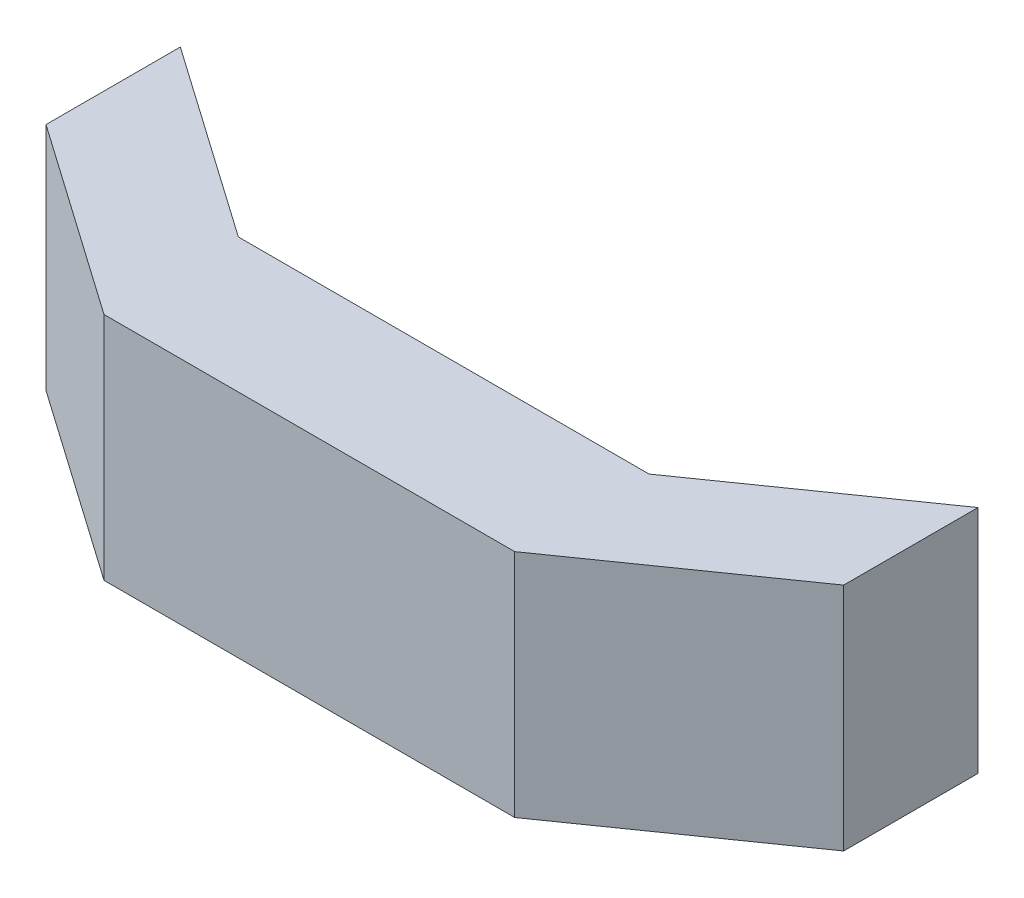
ISO-10303-21;
HEADER;
FILE_DESCRIPTION(('STEP AP214'),'2;1');
FILE_NAME('part.step','',(''),(''),'','','');
FILE_SCHEMA(('AUTOMOTIVE_DESIGN { 1 0 10303 214 1 1 1 1 }'));
ENDSEC;
DATA;
#1=APPLICATION_CONTEXT('core data for automotive mechanical design processes');
#2=APPLICATION_PROTOCOL_DEFINITION('international standard','automotive_design',2000,#1);
#3=PRODUCT_CONTEXT('',#1,'mechanical');
#4=PRODUCT('Part','Part','',(#3));
#5=PRODUCT_RELATED_PRODUCT_CATEGORY('part','',(#4));
#6=PRODUCT_DEFINITION_FORMATION('','',#4);
#7=PRODUCT_DEFINITION_CONTEXT('part definition',#1,'design');
#8=PRODUCT_DEFINITION('design','',#6,#7);
#9=PRODUCT_DEFINITION_SHAPE('','',#8);
#10=(LENGTH_UNIT() NAMED_UNIT(*) SI_UNIT(.MILLI.,.METRE.));
#11=(NAMED_UNIT(*) PLANE_ANGLE_UNIT() SI_UNIT($,.RADIAN.));
#12=(NAMED_UNIT(*) SI_UNIT($,.STERADIAN.) SOLID_ANGLE_UNIT());
#13=UNCERTAINTY_MEASURE_WITH_UNIT(LENGTH_MEASURE(1.E-05),#10,'distance_accuracy_value','');
#14=(GEOMETRIC_REPRESENTATION_CONTEXT(3) GLOBAL_UNCERTAINTY_ASSIGNED_CONTEXT((#13)) GLOBAL_UNIT_ASSIGNED_CONTEXT((#10,
#11,#12)) REPRESENTATION_CONTEXT('',''));
#15=CARTESIAN_POINT('',(0.,0.,0.));
#16=DIRECTION('',(0.,0.,1.));
#17=DIRECTION('',(1.,0.,0.));
#18=AXIS2_PLACEMENT_3D('',#15,#16,#17);
#19=CARTESIAN_POINT('',(53.5,60.,-17.5));
#20=DIRECTION('',(0.573576436350945,0.,0.819152044289063));
#21=DIRECTION('',(0.819152044289063,0.,-0.573576436350945));
#22=AXIS2_PLACEMENT_3D('',#19,#20,#21);
#23=PLANE('',#22);
#24=DIRECTION('',(-0.819152044289063,0.,0.573576436350945));
#25=VECTOR('',#24,1.);
#26=CARTESIAN_POINT('',(53.5,0.,-17.5));
#27=LINE('',#26,#25);
#28=CARTESIAN_POINT('',(103.911022230759,0.,-52.7981777748253));
#29=VERTEX_POINT('',#28);
#30=CARTESIAN_POINT('',(53.5,0.,-17.5));
#31=VERTEX_POINT('',#30);
#32=EDGE_CURVE('E133',#29,#31,#27,.T.);
#33=ORIENTED_EDGE('',*,*,#32,.T.);
#34=DIRECTION('',(0.,-1.,0.));
#35=VECTOR('',#34,1.);
#36=CARTESIAN_POINT('',(53.5,60.,-17.5));
#37=LINE('',#36,#35);
#38=CARTESIAN_POINT('',(53.5,60.,-17.5));
#39=VERTEX_POINT('',#38);
#40=EDGE_CURVE('E11',#39,#31,#37,.T.);
#41=ORIENTED_EDGE('',*,*,#40,.F.);
#42=DIRECTION('',(-0.819152044289063,0.,0.573576436350945));
#43=VECTOR('',#42,1.);
#44=CARTESIAN_POINT('',(53.5,60.,-17.5));
#45=LINE('',#44,#43);
#46=CARTESIAN_POINT('',(103.911022230759,60.,-52.7981777748253));
#47=VERTEX_POINT('',#46);
#48=EDGE_CURVE('E147',#47,#39,#45,.T.);
#49=ORIENTED_EDGE('',*,*,#48,.F.);
#50=DIRECTION('',(0.,-1.,0.));
#51=VECTOR('',#50,1.);
#52=CARTESIAN_POINT('',(103.911022230759,60.,-52.7981777748253));
#53=LINE('',#52,#51);
#54=EDGE_CURVE('E129',#47,#29,#53,.T.);
#55=ORIENTED_EDGE('',*,*,#54,.T.);
#56=EDGE_LOOP('',(#33,#41,#49,#55));
#57=FACE_BOUND('',#56,.T.);
#58=ADVANCED_FACE('F37',(#57),#23,.F.);
#59=CARTESIAN_POINT('',(-53.5,60.,-17.5));
#60=DIRECTION('',(0.,0.,1.));
#61=DIRECTION('',(1.,0.,0.));
#62=AXIS2_PLACEMENT_3D('',#59,#60,#61);
#63=PLANE('',#62);
#64=DIRECTION('',(-1.,0.,0.));
#65=VECTOR('',#64,1.);
#66=CARTESIAN_POINT('',(-53.5,0.,-17.5));
#67=LINE('',#66,#65);
#68=CARTESIAN_POINT('',(-53.5,0.,-17.5));
#69=VERTEX_POINT('',#68);
#70=EDGE_CURVE('E136',#31,#69,#67,.T.);
#71=ORIENTED_EDGE('',*,*,#70,.T.);
#72=DIRECTION('',(0.,-1.,0.));
#73=VECTOR('',#72,1.);
#74=CARTESIAN_POINT('',(-53.5,60.,-17.5));
#75=LINE('',#74,#73);
#76=CARTESIAN_POINT('',(-53.5,60.,-17.5));
#77=VERTEX_POINT('',#76);
#78=EDGE_CURVE('E45',#77,#69,#75,.T.);
#79=ORIENTED_EDGE('',*,*,#78,.F.);
#80=DIRECTION('',(-1.,0.,0.));
#81=VECTOR('',#80,1.);
#82=CARTESIAN_POINT('',(-53.5,60.,-17.5));
#83=LINE('',#82,#81);
#84=EDGE_CURVE('E96',#39,#77,#83,.T.);
#85=ORIENTED_EDGE('',*,*,#84,.F.);
#86=ORIENTED_EDGE('',*,*,#40,.T.);
#87=EDGE_LOOP('',(#71,#79,#85,#86));
#88=FACE_BOUND('',#87,.T.);
#89=ADVANCED_FACE('F182',(#88),#63,.F.);
#90=CARTESIAN_POINT('',(-53.5,60.,-17.5));
#91=DIRECTION('',(-0.573576436351042,0.,0.819152044288995));
#92=DIRECTION('',(0.819152044288995,0.,0.573576436351042));
#93=AXIS2_PLACEMENT_3D('',#90,#91,#92);
#94=PLANE('',#93);
#95=DIRECTION('',(-0.819152044288995,0.,-0.573576436351042));
#96=VECTOR('',#95,1.);
#97=CARTESIAN_POINT('',(-53.5,0.,-17.5));
#98=LINE('',#97,#96);
#99=CARTESIAN_POINT('',(-103.911022230746,0.,-52.7981777748253));
#100=VERTEX_POINT('',#99);
#101=EDGE_CURVE('E138',#69,#100,#98,.T.);
#102=ORIENTED_EDGE('',*,*,#101,.T.);
#103=DIRECTION('',(0.,-1.,0.));
#104=VECTOR('',#103,1.);
#105=CARTESIAN_POINT('',(-103.911022230746,60.,-52.7981777748253));
#106=LINE('',#105,#104);
#107=CARTESIAN_POINT('',(-103.911022230746,60.,-52.7981777748253));
#108=VERTEX_POINT('',#107);
#109=EDGE_CURVE('E154',#108,#100,#106,.T.);
#110=ORIENTED_EDGE('',*,*,#109,.F.);
#111=DIRECTION('',(-0.819152044288995,0.,-0.573576436351042));
#112=VECTOR('',#111,1.);
#113=CARTESIAN_POINT('',(-53.5,60.,-17.5));
#114=LINE('',#113,#112);
#115=EDGE_CURVE('E162',#77,#108,#114,.T.);
#116=ORIENTED_EDGE('',*,*,#115,.F.);
#117=ORIENTED_EDGE('',*,*,#78,.T.);
#118=EDGE_LOOP('',(#102,#110,#116,#117));
#119=FACE_BOUND('',#118,.T.);
#120=ADVANCED_FACE('F160',(#119),#94,.F.);
#121=CARTESIAN_POINT('',(-103.911022230746,60.,-52.7981777748253));
#122=DIRECTION('',(1.,0.,0.));
#123=DIRECTION('',(0.,0.,-1.));
#124=AXIS2_PLACEMENT_3D('',#121,#122,#123);
#125=PLANE('',#124);
#126=DIRECTION('',(0.,0.,1.));
#127=VECTOR('',#126,1.);
#128=CARTESIAN_POINT('',(-103.911022230746,0.,-52.7981777748253));
#129=LINE('',#128,#127);
#130=CARTESIAN_POINT('',(-103.911022230746,0.,-17.7981777748342));
#131=VERTEX_POINT('',#130);
#132=EDGE_CURVE('E140',#100,#131,#129,.T.);
#133=ORIENTED_EDGE('',*,*,#132,.T.);
#134=DIRECTION('',(0.,-1.,0.));
#135=VECTOR('',#134,1.);
#136=CARTESIAN_POINT('',(-103.911022230746,60.,-17.7981777748342));
#137=LINE('',#136,#135);
#138=CARTESIAN_POINT('',(-103.911022230746,60.,-17.7981777748342));
#139=VERTEX_POINT('',#138);
#140=EDGE_CURVE('E151',#139,#131,#137,.T.);
#141=ORIENTED_EDGE('',*,*,#140,.F.);
#142=DIRECTION('',(0.,0.,1.));
#143=VECTOR('',#142,1.);
#144=CARTESIAN_POINT('',(-103.911022230746,60.,-52.7981777748253));
#145=LINE('',#144,#143);
#146=EDGE_CURVE('E174',#108,#139,#145,.T.);
#147=ORIENTED_EDGE('',*,*,#146,.F.);
#148=ORIENTED_EDGE('',*,*,#109,.T.);
#149=EDGE_LOOP('',(#133,#141,#147,#148));
#150=FACE_BOUND('',#149,.T.);
#151=ADVANCED_FACE('F170',(#150),#125,.F.);
#152=CARTESIAN_POINT('',(-103.911022230746,60.,-17.7981777748342));
#153=DIRECTION('',(0.573576436351139,0.,-0.819152044288927));
#154=DIRECTION('',(-0.819152044288927,0.,-0.573576436351139));
#155=AXIS2_PLACEMENT_3D('',#152,#153,#154);
#156=PLANE('',#155);
#157=DIRECTION('',(0.819152044288927,0.,0.573576436351139));
#158=VECTOR('',#157,1.);
#159=CARTESIAN_POINT('',(-103.911022230746,0.,-17.7981777748342));
#160=LINE('',#159,#158);
#161=CARTESIAN_POINT('',(-53.5,0.,17.5));
#162=VERTEX_POINT('',#161);
#163=EDGE_CURVE('E142',#131,#162,#160,.T.);
#164=ORIENTED_EDGE('',*,*,#163,.T.);
#165=DIRECTION('',(0.,-1.,0.));
#166=VECTOR('',#165,1.);
#167=CARTESIAN_POINT('',(-53.5,60.,17.5));
#168=LINE('',#167,#166);
#169=CARTESIAN_POINT('',(-53.5,60.,17.5));
#170=VERTEX_POINT('',#169);
#171=EDGE_CURVE('E124',#170,#162,#168,.T.);
#172=ORIENTED_EDGE('',*,*,#171,.F.);
#173=DIRECTION('',(0.819152044288927,0.,0.573576436351139));
#174=VECTOR('',#173,1.);
#175=CARTESIAN_POINT('',(-103.911022230746,60.,-17.7981777748342));
#176=LINE('',#175,#174);
#177=EDGE_CURVE('E115',#139,#170,#176,.T.);
#178=ORIENTED_EDGE('',*,*,#177,.F.);
#179=ORIENTED_EDGE('',*,*,#140,.T.);
#180=EDGE_LOOP('',(#164,#172,#178,#179));
#181=FACE_BOUND('',#180,.T.);
#182=ADVANCED_FACE('F173',(#181),#156,.F.);
#183=CARTESIAN_POINT('',(-53.5,60.,17.5));
#184=DIRECTION('',(0.,0.,-1.));
#185=DIRECTION('',(-1.,0.,0.));
#186=AXIS2_PLACEMENT_3D('',#183,#184,#185);
#187=PLANE('',#186);
#188=DIRECTION('',(1.,0.,0.));
#189=VECTOR('',#188,1.);
#190=CARTESIAN_POINT('',(-53.5,0.,17.5));
#191=LINE('',#190,#189);
#192=CARTESIAN_POINT('',(53.5,0.,17.5));
#193=VERTEX_POINT('',#192);
#194=EDGE_CURVE('E123',#162,#193,#191,.T.);
#195=ORIENTED_EDGE('',*,*,#194,.T.);
#196=DIRECTION('',(0.,-1.,0.));
#197=VECTOR('',#196,1.);
#198=CARTESIAN_POINT('',(53.5,60.,17.5));
#199=LINE('',#198,#197);
#200=CARTESIAN_POINT('',(53.5,60.,17.5));
#201=VERTEX_POINT('',#200);
#202=EDGE_CURVE('E120',#201,#193,#199,.T.);
#203=ORIENTED_EDGE('',*,*,#202,.F.);
#204=DIRECTION('',(1.,0.,0.));
#205=VECTOR('',#204,1.);
#206=CARTESIAN_POINT('',(-53.5,60.,17.5));
#207=LINE('',#206,#205);
#208=EDGE_CURVE('E109',#170,#201,#207,.T.);
#209=ORIENTED_EDGE('',*,*,#208,.F.);
#210=ORIENTED_EDGE('',*,*,#171,.T.);
#211=EDGE_LOOP('',(#195,#203,#209,#210));
#212=FACE_BOUND('',#211,.T.);
#213=ADVANCED_FACE('F121',(#212),#187,.F.);
#214=CARTESIAN_POINT('',(103.911022230759,60.,-17.7981777748342));
#215=DIRECTION('',(-0.573576436351042,0.,-0.819152044288995));
#216=DIRECTION('',(-0.819152044288995,0.,0.573576436351042));
#217=AXIS2_PLACEMENT_3D('',#214,#215,#216);
#218=PLANE('',#217);
#219=DIRECTION('',(0.819152044288995,0.,-0.573576436351042));
#220=VECTOR('',#219,1.);
#221=CARTESIAN_POINT('',(103.911022230759,0.,-17.7981777748342));
#222=LINE('',#221,#220);
#223=CARTESIAN_POINT('',(103.911022230759,0.,-17.7981777748342));
#224=VERTEX_POINT('',#223);
#225=EDGE_CURVE('E82',#193,#224,#222,.T.);
#226=ORIENTED_EDGE('',*,*,#225,.T.);
#227=DIRECTION('',(0.,-1.,0.));
#228=VECTOR('',#227,1.);
#229=CARTESIAN_POINT('',(103.911022230759,60.,-17.7981777748342));
#230=LINE('',#229,#228);
#231=CARTESIAN_POINT('',(103.911022230759,60.,-17.7981777748342));
#232=VERTEX_POINT('',#231);
#233=EDGE_CURVE('E125',#232,#224,#230,.T.);
#234=ORIENTED_EDGE('',*,*,#233,.F.);
#235=DIRECTION('',(0.819152044288995,0.,-0.573576436351042));
#236=VECTOR('',#235,1.);
#237=CARTESIAN_POINT('',(103.911022230759,60.,-17.7981777748342));
#238=LINE('',#237,#236);
#239=EDGE_CURVE('E113',#201,#232,#238,.T.);
#240=ORIENTED_EDGE('',*,*,#239,.F.);
#241=ORIENTED_EDGE('',*,*,#202,.T.);
#242=EDGE_LOOP('',(#226,#234,#240,#241));
#243=FACE_BOUND('',#242,.T.);
#244=ADVANCED_FACE('F127',(#243),#218,.F.);
#245=CARTESIAN_POINT('',(103.911022230759,60.,-52.7981777748253));
#246=DIRECTION('',(-1.,0.,0.));
#247=DIRECTION('',(0.,0.,1.));
#248=AXIS2_PLACEMENT_3D('',#245,#246,#247);
#249=PLANE('',#248);
#250=DIRECTION('',(0.,0.,-1.));
#251=VECTOR('',#250,1.);
#252=CARTESIAN_POINT('',(103.911022230759,0.,-52.7981777748253));
#253=LINE('',#252,#251);
#254=EDGE_CURVE('E88',#224,#29,#253,.T.);
#255=ORIENTED_EDGE('',*,*,#254,.T.);
#256=ORIENTED_EDGE('',*,*,#54,.F.);
#257=DIRECTION('',(0.,0.,-1.));
#258=VECTOR('',#257,1.);
#259=CARTESIAN_POINT('',(103.911022230759,60.,-52.7981777748253));
#260=LINE('',#259,#258);
#261=EDGE_CURVE('E53',#232,#47,#260,.T.);
#262=ORIENTED_EDGE('',*,*,#261,.F.);
#263=ORIENTED_EDGE('',*,*,#233,.T.);
#264=EDGE_LOOP('',(#255,#256,#262,#263));
#265=FACE_BOUND('',#264,.T.);
#266=ADVANCED_FACE('F198',(#265),#249,.F.);
#267=CARTESIAN_POINT('',(0.,60.,0.));
#268=DIRECTION('',(0.,-1.,0.));
#269=DIRECTION('',(0.,0.,-1.));
#270=AXIS2_PLACEMENT_3D('',#267,#268,#269);
#271=PLANE('',#270);
#272=ORIENTED_EDGE('',*,*,#48,.T.);
#273=ORIENTED_EDGE('',*,*,#84,.T.);
#274=ORIENTED_EDGE('',*,*,#115,.T.);
#275=ORIENTED_EDGE('',*,*,#146,.T.);
#276=ORIENTED_EDGE('',*,*,#177,.T.);
#277=ORIENTED_EDGE('',*,*,#208,.T.);
#278=ORIENTED_EDGE('',*,*,#239,.T.);
#279=ORIENTED_EDGE('',*,*,#261,.T.);
#280=EDGE_LOOP('',(#272,#273,#274,#275,#276,#277,#278,#279));
#281=FACE_BOUND('',#280,.T.);
#282=ADVANCED_FACE('F111',(#281),#271,.F.);
#283=CARTESIAN_POINT('',(0.,0.,0.));
#284=DIRECTION('',(0.,-1.,0.));
#285=DIRECTION('',(0.,0.,-1.));
#286=AXIS2_PLACEMENT_3D('',#283,#284,#285);
#287=PLANE('',#286);
#288=ORIENTED_EDGE('',*,*,#32,.F.);
#289=ORIENTED_EDGE('',*,*,#254,.F.);
#290=ORIENTED_EDGE('',*,*,#225,.F.);
#291=ORIENTED_EDGE('',*,*,#194,.F.);
#292=ORIENTED_EDGE('',*,*,#163,.F.);
#293=ORIENTED_EDGE('',*,*,#132,.F.);
#294=ORIENTED_EDGE('',*,*,#101,.F.);
#295=ORIENTED_EDGE('',*,*,#70,.F.);
#296=EDGE_LOOP('',(#288,#289,#290,#291,#292,#293,#294,#295));
#297=FACE_BOUND('',#296,.T.);
#298=ADVANCED_FACE('F166',(#297),#287,.T.);
#299=CLOSED_SHELL('',(#58,#89,#120,#151,#182,#213,#244,#266,#282,#298));
#300=MANIFOLD_SOLID_BREP('B2',#299);
#301=ADVANCED_BREP_SHAPE_REPRESENTATION('',(#18,#300),#14);
#302=SHAPE_DEFINITION_REPRESENTATION(#9,#301);
ENDSEC;
END-ISO-10303-21;
